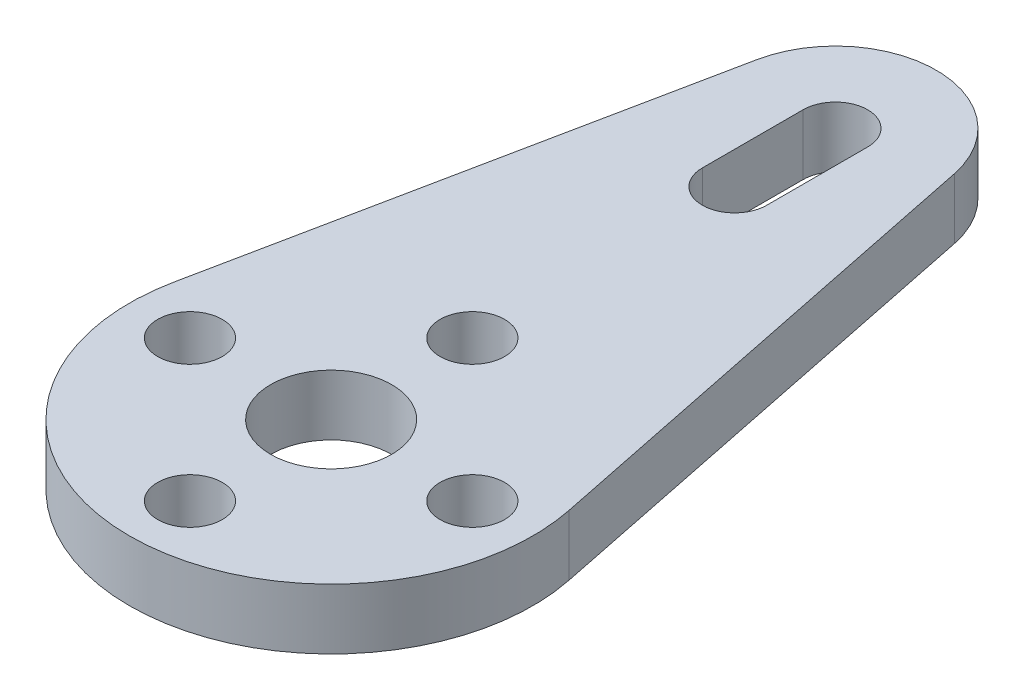
ISO-10303-21;
HEADER;
FILE_DESCRIPTION(('STEP AP214'),'2;1');
FILE_NAME('part.step','',(''),(''),'','','');
FILE_SCHEMA(('AUTOMOTIVE_DESIGN { 1 0 10303 214 1 1 1 1 }'));
ENDSEC;
DATA;
#1=APPLICATION_CONTEXT('core data for automotive mechanical design processes');
#2=APPLICATION_PROTOCOL_DEFINITION('international standard','automotive_design',2000,#1);
#3=PRODUCT_CONTEXT('',#1,'mechanical');
#4=PRODUCT('Part','Part','',(#3));
#5=PRODUCT_RELATED_PRODUCT_CATEGORY('part','',(#4));
#6=PRODUCT_DEFINITION_FORMATION('','',#4);
#7=PRODUCT_DEFINITION_CONTEXT('part definition',#1,'design');
#8=PRODUCT_DEFINITION('design','',#6,#7);
#9=PRODUCT_DEFINITION_SHAPE('','',#8);
#10=(LENGTH_UNIT() NAMED_UNIT(*) SI_UNIT(.MILLI.,.METRE.));
#11=(NAMED_UNIT(*) PLANE_ANGLE_UNIT() SI_UNIT($,.RADIAN.));
#12=(NAMED_UNIT(*) SI_UNIT($,.STERADIAN.) SOLID_ANGLE_UNIT());
#13=UNCERTAINTY_MEASURE_WITH_UNIT(LENGTH_MEASURE(1.E-05),#10,'distance_accuracy_value','');
#14=(GEOMETRIC_REPRESENTATION_CONTEXT(3) GLOBAL_UNCERTAINTY_ASSIGNED_CONTEXT((#13)) GLOBAL_UNIT_ASSIGNED_CONTEXT((#10,
#11,#12)) REPRESENTATION_CONTEXT('',''));
#15=CARTESIAN_POINT('',(0.,0.,0.));
#16=DIRECTION('',(0.,0.,1.));
#17=DIRECTION('',(1.,0.,0.));
#18=AXIS2_PLACEMENT_3D('',#15,#16,#17);
#19=CARTESIAN_POINT('',(0.,3.,-25.));
#20=DIRECTION('',(0.,1.,0.));
#21=DIRECTION('',(0.,0.,1.));
#22=AXIS2_PLACEMENT_3D('',#19,#20,#21);
#23=PLANE('',#22);
#24=CARTESIAN_POINT('',(3.9618942650685E-13,3.,7.));
#25=DIRECTION('',(0.,1.,0.));
#26=DIRECTION('',(0.,0.,1.));
#27=AXIS2_PLACEMENT_3D('',#24,#25,#26);
#28=CIRCLE('',#27,1.60000000000043);
#29=CARTESIAN_POINT('',(3.9618942650685E-13,3.,8.60000000000043));
#30=VERTEX_POINT('',#29);
#31=EDGE_CURVE('E139',#30,#30,#28,.T.);
#32=ORIENTED_EDGE('',*,*,#31,.F.);
#33=EDGE_LOOP('',(#32));
#34=FACE_BOUND('',#33,.T.);
#35=CARTESIAN_POINT('',(0.,3.,-7.));
#36=DIRECTION('',(0.,1.,0.));
#37=DIRECTION('',(0.,0.,1.));
#38=AXIS2_PLACEMENT_3D('',#35,#36,#37);
#39=CIRCLE('',#38,1.6);
#40=CARTESIAN_POINT('',(0.,3.,-5.4));
#41=VERTEX_POINT('',#40);
#42=EDGE_CURVE('E151',#41,#41,#39,.T.);
#43=ORIENTED_EDGE('',*,*,#42,.F.);
#44=EDGE_LOOP('',(#43));
#45=FACE_BOUND('',#44,.T.);
#46=CARTESIAN_POINT('',(0.,3.,-25.));
#47=DIRECTION('',(0.,1.,0.));
#48=DIRECTION('',(0.,0.,1.));
#49=AXIS2_PLACEMENT_3D('',#46,#47,#48);
#50=CIRCLE('',#49,5.);
#51=CARTESIAN_POINT('',(4.89897948556635,3.,-26.));
#52=VERTEX_POINT('',#51);
#53=CARTESIAN_POINT('',(-4.89897948556636,3.,-26.));
#54=VERTEX_POINT('',#53);
#55=EDGE_CURVE('E163',#52,#54,#50,.T.);
#56=ORIENTED_EDGE('',*,*,#55,.T.);
#57=DIRECTION('',(-0.2,0.,0.979795897113271));
#58=VECTOR('',#57,1.);
#59=CARTESIAN_POINT('',(-4.89897948556636,3.,-26.));
#60=LINE('',#59,#58);
#61=CARTESIAN_POINT('',(-9.79795897113271,3.,-2.));
#62=VERTEX_POINT('',#61);
#63=EDGE_CURVE('E166',#54,#62,#60,.T.);
#64=ORIENTED_EDGE('',*,*,#63,.T.);
#65=CARTESIAN_POINT('',(0.,3.,0.));
#66=DIRECTION('',(0.,1.,0.));
#67=DIRECTION('',(0.,0.,1.));
#68=AXIS2_PLACEMENT_3D('',#65,#66,#67);
#69=CIRCLE('',#68,10.);
#70=CARTESIAN_POINT('',(9.79795897113271,3.,-2.));
#71=VERTEX_POINT('',#70);
#72=EDGE_CURVE('E169',#62,#71,#69,.T.);
#73=ORIENTED_EDGE('',*,*,#72,.T.);
#74=DIRECTION('',(-0.2,0.,-0.979795897113271));
#75=VECTOR('',#74,1.);
#76=CARTESIAN_POINT('',(4.89897948556635,3.,-26.));
#77=LINE('',#76,#75);
#78=EDGE_CURVE('E171',#71,#52,#77,.T.);
#79=ORIENTED_EDGE('',*,*,#78,.T.);
#80=EDGE_LOOP('',(#56,#64,#73,#79));
#81=FACE_BOUND('',#80,.T.);
#82=CARTESIAN_POINT('',(0.,3.,0.));
#83=DIRECTION('',(0.,1.,0.));
#84=DIRECTION('',(0.,0.,1.));
#85=AXIS2_PLACEMENT_3D('',#82,#83,#84);
#86=CIRCLE('',#85,3.);
#87=CARTESIAN_POINT('',(0.,3.,3.));
#88=VERTEX_POINT('',#87);
#89=EDGE_CURVE('E157',#88,#88,#86,.T.);
#90=ORIENTED_EDGE('',*,*,#89,.F.);
#91=EDGE_LOOP('',(#90));
#92=FACE_BOUND('',#91,.T.);
#93=CARTESIAN_POINT('',(7.0000000000002,3.,-1.98094713253425E-13));
#94=DIRECTION('',(0.,1.,0.));
#95=DIRECTION('',(0.,0.,1.));
#96=AXIS2_PLACEMENT_3D('',#93,#94,#95);
#97=CIRCLE('',#96,1.60000000000016);
#98=CARTESIAN_POINT('',(7.0000000000002,3.,1.59999999999996));
#99=VERTEX_POINT('',#98);
#100=EDGE_CURVE('E145',#99,#99,#97,.T.);
#101=ORIENTED_EDGE('',*,*,#100,.F.);
#102=EDGE_LOOP('',(#101));
#103=FACE_BOUND('',#102,.T.);
#104=CARTESIAN_POINT('',(-6.9999999999998,3.,1.98951966012828E-13));
#105=DIRECTION('',(0.,1.,0.));
#106=DIRECTION('',(0.,0.,1.));
#107=AXIS2_PLACEMENT_3D('',#104,#105,#106);
#108=CIRCLE('',#107,1.60000000000032);
#109=CARTESIAN_POINT('',(-6.9999999999998,3.,1.60000000000052));
#110=VERTEX_POINT('',#109);
#111=EDGE_CURVE('E133',#110,#110,#108,.T.);
#112=ORIENTED_EDGE('',*,*,#111,.F.);
#113=EDGE_LOOP('',(#112));
#114=FACE_BOUND('',#113,.T.);
#115=DIRECTION('',(0.,0.,1.));
#116=VECTOR('',#115,1.);
#117=CARTESIAN_POINT('',(-1.6,3.,-25.));
#118=LINE('',#117,#116);
#119=CARTESIAN_POINT('',(-1.6,3.,-25.));
#120=VERTEX_POINT('',#119);
#121=CARTESIAN_POINT('',(-1.6,3.,-20.));
#122=VERTEX_POINT('',#121);
#123=EDGE_CURVE('E105',#120,#122,#118,.T.);
#124=ORIENTED_EDGE('',*,*,#123,.F.);
#125=CARTESIAN_POINT('',(0.,3.,-25.));
#126=DIRECTION('',(0.,1.,0.));
#127=DIRECTION('',(0.,0.,1.));
#128=AXIS2_PLACEMENT_3D('',#125,#126,#127);
#129=CIRCLE('',#128,1.6);
#130=CARTESIAN_POINT('',(1.6,3.,-25.));
#131=VERTEX_POINT('',#130);
#132=EDGE_CURVE('E97',#131,#120,#129,.T.);
#133=ORIENTED_EDGE('',*,*,#132,.F.);
#134=DIRECTION('',(0.,0.,-1.));
#135=VECTOR('',#134,1.);
#136=CARTESIAN_POINT('',(1.6,3.,-25.));
#137=LINE('',#136,#135);
#138=CARTESIAN_POINT('',(1.6,3.,-20.));
#139=VERTEX_POINT('',#138);
#140=EDGE_CURVE('E119',#139,#131,#137,.T.);
#141=ORIENTED_EDGE('',*,*,#140,.F.);
#142=CARTESIAN_POINT('',(0.,3.,-20.));
#143=DIRECTION('',(0.,1.,0.));
#144=DIRECTION('',(0.,0.,1.));
#145=AXIS2_PLACEMENT_3D('',#142,#143,#144);
#146=CIRCLE('',#145,1.6);
#147=EDGE_CURVE('E117',#122,#139,#146,.T.);
#148=ORIENTED_EDGE('',*,*,#147,.F.);
#149=EDGE_LOOP('',(#124,#133,#141,#148));
#150=FACE_BOUND('',#149,.T.);
#151=ADVANCED_FACE('F32',(#34,#45,#81,#92,#103,#114,#150),#23,.T.);
#152=CARTESIAN_POINT('',(0.,0.,-25.));
#153=DIRECTION('',(0.,1.,0.));
#154=DIRECTION('',(0.,0.,1.));
#155=AXIS2_PLACEMENT_3D('',#152,#153,#154);
#156=PLANE('',#155);
#157=CARTESIAN_POINT('',(-6.9999999999998,0.,1.98951966012828E-13));
#158=DIRECTION('',(0.,1.,0.));
#159=DIRECTION('',(0.,0.,1.));
#160=AXIS2_PLACEMENT_3D('',#157,#158,#159);
#161=CIRCLE('',#160,1.60000000000032);
#162=CARTESIAN_POINT('',(-6.9999999999998,0.,1.60000000000052));
#163=VERTEX_POINT('',#162);
#164=EDGE_CURVE('E113',#163,#163,#161,.T.);
#165=ORIENTED_EDGE('',*,*,#164,.T.);
#166=EDGE_LOOP('',(#165));
#167=FACE_BOUND('',#166,.T.);
#168=CARTESIAN_POINT('',(3.9618942650685E-13,0.,7.));
#169=DIRECTION('',(0.,1.,0.));
#170=DIRECTION('',(0.,0.,1.));
#171=AXIS2_PLACEMENT_3D('',#168,#169,#170);
#172=CIRCLE('',#171,1.60000000000043);
#173=CARTESIAN_POINT('',(3.9618942650685E-13,0.,8.60000000000043));
#174=VERTEX_POINT('',#173);
#175=EDGE_CURVE('E136',#174,#174,#172,.T.);
#176=ORIENTED_EDGE('',*,*,#175,.T.);
#177=EDGE_LOOP('',(#176));
#178=FACE_BOUND('',#177,.T.);
#179=CARTESIAN_POINT('',(7.0000000000002,0.,-1.98094713253425E-13));
#180=DIRECTION('',(0.,1.,0.));
#181=DIRECTION('',(0.,0.,1.));
#182=AXIS2_PLACEMENT_3D('',#179,#180,#181);
#183=CIRCLE('',#182,1.60000000000016);
#184=CARTESIAN_POINT('',(7.0000000000002,0.,1.59999999999996));
#185=VERTEX_POINT('',#184);
#186=EDGE_CURVE('E142',#185,#185,#183,.T.);
#187=ORIENTED_EDGE('',*,*,#186,.T.);
#188=EDGE_LOOP('',(#187));
#189=FACE_BOUND('',#188,.T.);
#190=CARTESIAN_POINT('',(0.,0.,-7.));
#191=DIRECTION('',(0.,1.,0.));
#192=DIRECTION('',(0.,0.,1.));
#193=AXIS2_PLACEMENT_3D('',#190,#191,#192);
#194=CIRCLE('',#193,1.6);
#195=CARTESIAN_POINT('',(0.,0.,-5.4));
#196=VERTEX_POINT('',#195);
#197=EDGE_CURVE('E148',#196,#196,#194,.T.);
#198=ORIENTED_EDGE('',*,*,#197,.T.);
#199=EDGE_LOOP('',(#198));
#200=FACE_BOUND('',#199,.T.);
#201=CARTESIAN_POINT('',(0.,0.,0.));
#202=DIRECTION('',(0.,1.,0.));
#203=DIRECTION('',(0.,0.,1.));
#204=AXIS2_PLACEMENT_3D('',#201,#202,#203);
#205=CIRCLE('',#204,3.);
#206=CARTESIAN_POINT('',(0.,0.,3.));
#207=VERTEX_POINT('',#206);
#208=EDGE_CURVE('E154',#207,#207,#205,.T.);
#209=ORIENTED_EDGE('',*,*,#208,.T.);
#210=EDGE_LOOP('',(#209));
#211=FACE_BOUND('',#210,.T.);
#212=CARTESIAN_POINT('',(0.,0.,-25.));
#213=DIRECTION('',(0.,1.,0.));
#214=DIRECTION('',(0.,0.,1.));
#215=AXIS2_PLACEMENT_3D('',#212,#213,#214);
#216=CIRCLE('',#215,5.);
#217=CARTESIAN_POINT('',(4.89897948556635,0.,-26.));
#218=VERTEX_POINT('',#217);
#219=CARTESIAN_POINT('',(-4.89897948556636,0.,-26.));
#220=VERTEX_POINT('',#219);
#221=EDGE_CURVE('E160',#218,#220,#216,.T.);
#222=ORIENTED_EDGE('',*,*,#221,.F.);
#223=DIRECTION('',(-0.2,0.,-0.979795897113271));
#224=VECTOR('',#223,1.);
#225=CARTESIAN_POINT('',(4.89897948556635,0.,-26.));
#226=LINE('',#225,#224);
#227=CARTESIAN_POINT('',(9.79795897113271,0.,-2.));
#228=VERTEX_POINT('',#227);
#229=EDGE_CURVE('E167',#228,#218,#226,.T.);
#230=ORIENTED_EDGE('',*,*,#229,.F.);
#231=CARTESIAN_POINT('',(0.,0.,0.));
#232=DIRECTION('',(0.,1.,0.));
#233=DIRECTION('',(0.,0.,1.));
#234=AXIS2_PLACEMENT_3D('',#231,#232,#233);
#235=CIRCLE('',#234,10.);
#236=CARTESIAN_POINT('',(-9.79795897113271,0.,-2.));
#237=VERTEX_POINT('',#236);
#238=EDGE_CURVE('E178',#237,#228,#235,.T.);
#239=ORIENTED_EDGE('',*,*,#238,.F.);
#240=DIRECTION('',(-0.2,0.,0.979795897113271));
#241=VECTOR('',#240,1.);
#242=CARTESIAN_POINT('',(-4.89897948556636,0.,-26.));
#243=LINE('',#242,#241);
#244=EDGE_CURVE('E176',#220,#237,#243,.T.);
#245=ORIENTED_EDGE('',*,*,#244,.F.);
#246=EDGE_LOOP('',(#222,#230,#239,#245));
#247=FACE_BOUND('',#246,.T.);
#248=CARTESIAN_POINT('',(0.,0.,-25.));
#249=DIRECTION('',(0.,1.,0.));
#250=DIRECTION('',(0.,0.,1.));
#251=AXIS2_PLACEMENT_3D('',#248,#249,#250);
#252=CIRCLE('',#251,1.6);
#253=CARTESIAN_POINT('',(1.6,0.,-25.));
#254=VERTEX_POINT('',#253);
#255=CARTESIAN_POINT('',(-1.6,0.,-25.));
#256=VERTEX_POINT('',#255);
#257=EDGE_CURVE('E55',#254,#256,#252,.T.);
#258=ORIENTED_EDGE('',*,*,#257,.T.);
#259=DIRECTION('',(0.,0.,1.));
#260=VECTOR('',#259,1.);
#261=CARTESIAN_POINT('',(-1.6,0.,-25.));
#262=LINE('',#261,#260);
#263=CARTESIAN_POINT('',(-1.6,0.,-20.));
#264=VERTEX_POINT('',#263);
#265=EDGE_CURVE('E112',#256,#264,#262,.T.);
#266=ORIENTED_EDGE('',*,*,#265,.T.);
#267=CARTESIAN_POINT('',(0.,0.,-20.));
#268=DIRECTION('',(0.,1.,0.));
#269=DIRECTION('',(0.,0.,1.));
#270=AXIS2_PLACEMENT_3D('',#267,#268,#269);
#271=CIRCLE('',#270,1.6);
#272=CARTESIAN_POINT('',(1.6,0.,-20.));
#273=VERTEX_POINT('',#272);
#274=EDGE_CURVE('E125',#264,#273,#271,.T.);
#275=ORIENTED_EDGE('',*,*,#274,.T.);
#276=DIRECTION('',(0.,0.,-1.));
#277=VECTOR('',#276,1.);
#278=CARTESIAN_POINT('',(1.6,0.,-25.));
#279=LINE('',#278,#277);
#280=EDGE_CURVE('E106',#273,#254,#279,.T.);
#281=ORIENTED_EDGE('',*,*,#280,.T.);
#282=EDGE_LOOP('',(#258,#266,#275,#281));
#283=FACE_BOUND('',#282,.T.);
#284=ADVANCED_FACE('F196',(#167,#178,#189,#200,#211,#247,#283),#156,.F.);
#285=CARTESIAN_POINT('',(0.,3.,-25.));
#286=DIRECTION('',(0.,-1.,0.));
#287=DIRECTION('',(0.,0.,-1.));
#288=AXIS2_PLACEMENT_3D('',#285,#286,#287);
#289=CYLINDRICAL_SURFACE('',#288,5.);
#290=ORIENTED_EDGE('',*,*,#221,.T.);
#291=DIRECTION('',(0.,-1.,0.));
#292=VECTOR('',#291,1.);
#293=CARTESIAN_POINT('',(-4.89897948556636,3.,-26.));
#294=LINE('',#293,#292);
#295=EDGE_CURVE('E11',#54,#220,#294,.T.);
#296=ORIENTED_EDGE('',*,*,#295,.F.);
#297=ORIENTED_EDGE('',*,*,#55,.F.);
#298=DIRECTION('',(0.,-1.,0.));
#299=VECTOR('',#298,1.);
#300=CARTESIAN_POINT('',(4.89897948556635,3.,-26.));
#301=LINE('',#300,#299);
#302=EDGE_CURVE('E173',#52,#218,#301,.T.);
#303=ORIENTED_EDGE('',*,*,#302,.T.);
#304=EDGE_LOOP('',(#290,#296,#297,#303));
#305=FACE_BOUND('',#304,.T.);
#306=ADVANCED_FACE('F34',(#305),#289,.T.);
#307=CARTESIAN_POINT('',(-4.89897948556636,3.,-26.));
#308=DIRECTION('',(0.979795897113271,0.,0.2));
#309=DIRECTION('',(0.2,0.,-0.979795897113271));
#310=AXIS2_PLACEMENT_3D('',#307,#308,#309);
#311=PLANE('',#310);
#312=ORIENTED_EDGE('',*,*,#244,.T.);
#313=DIRECTION('',(0.,-1.,0.));
#314=VECTOR('',#313,1.);
#315=CARTESIAN_POINT('',(-9.79795897113271,3.,-2.));
#316=LINE('',#315,#314);
#317=EDGE_CURVE('E40',#62,#237,#316,.T.);
#318=ORIENTED_EDGE('',*,*,#317,.F.);
#319=ORIENTED_EDGE('',*,*,#63,.F.);
#320=ORIENTED_EDGE('',*,*,#295,.T.);
#321=EDGE_LOOP('',(#312,#318,#319,#320));
#322=FACE_BOUND('',#321,.T.);
#323=ADVANCED_FACE('F207',(#322),#311,.F.);
#324=CARTESIAN_POINT('',(0.,3.,0.));
#325=DIRECTION('',(0.,-1.,0.));
#326=DIRECTION('',(0.,0.,-1.));
#327=AXIS2_PLACEMENT_3D('',#324,#325,#326);
#328=CYLINDRICAL_SURFACE('',#327,10.);
#329=ORIENTED_EDGE('',*,*,#238,.T.);
#330=DIRECTION('',(0.,-1.,0.));
#331=VECTOR('',#330,1.);
#332=CARTESIAN_POINT('',(9.79795897113271,3.,-2.));
#333=LINE('',#332,#331);
#334=EDGE_CURVE('E183',#71,#228,#333,.T.);
#335=ORIENTED_EDGE('',*,*,#334,.F.);
#336=ORIENTED_EDGE('',*,*,#72,.F.);
#337=ORIENTED_EDGE('',*,*,#317,.T.);
#338=EDGE_LOOP('',(#329,#335,#336,#337));
#339=FACE_BOUND('',#338,.T.);
#340=ADVANCED_FACE('F190',(#339),#328,.T.);
#341=CARTESIAN_POINT('',(4.89897948556635,3.,-26.));
#342=DIRECTION('',(-0.979795897113271,0.,0.2));
#343=DIRECTION('',(0.2,0.,0.979795897113271));
#344=AXIS2_PLACEMENT_3D('',#341,#342,#343);
#345=PLANE('',#344);
#346=ORIENTED_EDGE('',*,*,#229,.T.);
#347=ORIENTED_EDGE('',*,*,#302,.F.);
#348=ORIENTED_EDGE('',*,*,#78,.F.);
#349=ORIENTED_EDGE('',*,*,#334,.T.);
#350=EDGE_LOOP('',(#346,#347,#348,#349));
#351=FACE_BOUND('',#350,.T.);
#352=ADVANCED_FACE('F200',(#351),#345,.F.);
#353=CARTESIAN_POINT('',(0.,3.,0.));
#354=DIRECTION('',(0.,-1.,0.));
#355=DIRECTION('',(0.,0.,-1.));
#356=AXIS2_PLACEMENT_3D('',#353,#354,#355);
#357=CYLINDRICAL_SURFACE('',#356,3.);
#358=ORIENTED_EDGE('',*,*,#89,.T.);
#359=EDGE_LOOP('',(#358));
#360=FACE_BOUND('',#359,.T.);
#361=ORIENTED_EDGE('',*,*,#208,.F.);
#362=EDGE_LOOP('',(#361));
#363=FACE_BOUND('',#362,.T.);
#364=ADVANCED_FACE('F225',(#360,#363),#357,.F.);
#365=CARTESIAN_POINT('',(0.,3.,-7.));
#366=DIRECTION('',(0.,-1.,0.));
#367=DIRECTION('',(0.,0.,-1.));
#368=AXIS2_PLACEMENT_3D('',#365,#366,#367);
#369=CYLINDRICAL_SURFACE('',#368,1.6);
#370=ORIENTED_EDGE('',*,*,#42,.T.);
#371=EDGE_LOOP('',(#370));
#372=FACE_BOUND('',#371,.T.);
#373=ORIENTED_EDGE('',*,*,#197,.F.);
#374=EDGE_LOOP('',(#373));
#375=FACE_BOUND('',#374,.T.);
#376=ADVANCED_FACE('F232',(#372,#375),#369,.F.);
#377=CARTESIAN_POINT('',(7.0000000000002,3.,-1.98094713253425E-13));
#378=DIRECTION('',(0.,-1.,0.));
#379=DIRECTION('',(0.,0.,-1.));
#380=AXIS2_PLACEMENT_3D('',#377,#378,#379);
#381=CYLINDRICAL_SURFACE('',#380,1.60000000000016);
#382=ORIENTED_EDGE('',*,*,#100,.T.);
#383=EDGE_LOOP('',(#382));
#384=FACE_BOUND('',#383,.T.);
#385=ORIENTED_EDGE('',*,*,#186,.F.);
#386=EDGE_LOOP('',(#385));
#387=FACE_BOUND('',#386,.T.);
#388=ADVANCED_FACE('F237',(#384,#387),#381,.F.);
#389=CARTESIAN_POINT('',(3.9618942650685E-13,3.,7.));
#390=DIRECTION('',(0.,-1.,0.));
#391=DIRECTION('',(0.,0.,-1.));
#392=AXIS2_PLACEMENT_3D('',#389,#390,#391);
#393=CYLINDRICAL_SURFACE('',#392,1.60000000000043);
#394=ORIENTED_EDGE('',*,*,#31,.T.);
#395=EDGE_LOOP('',(#394));
#396=FACE_BOUND('',#395,.T.);
#397=ORIENTED_EDGE('',*,*,#175,.F.);
#398=EDGE_LOOP('',(#397));
#399=FACE_BOUND('',#398,.T.);
#400=ADVANCED_FACE('F251',(#396,#399),#393,.F.);
#401=CARTESIAN_POINT('',(-6.9999999999998,3.,1.98951966012828E-13));
#402=DIRECTION('',(0.,-1.,0.));
#403=DIRECTION('',(0.,0.,-1.));
#404=AXIS2_PLACEMENT_3D('',#401,#402,#403);
#405=CYLINDRICAL_SURFACE('',#404,1.60000000000032);
#406=ORIENTED_EDGE('',*,*,#111,.T.);
#407=EDGE_LOOP('',(#406));
#408=FACE_BOUND('',#407,.T.);
#409=ORIENTED_EDGE('',*,*,#164,.F.);
#410=EDGE_LOOP('',(#409));
#411=FACE_BOUND('',#410,.T.);
#412=ADVANCED_FACE('F248',(#408,#411),#405,.F.);
#413=CARTESIAN_POINT('',(0.,3.,-25.));
#414=DIRECTION('',(0.,-1.,0.));
#415=DIRECTION('',(0.,0.,-1.));
#416=AXIS2_PLACEMENT_3D('',#413,#414,#415);
#417=CYLINDRICAL_SURFACE('',#416,1.6);
#418=ORIENTED_EDGE('',*,*,#257,.F.);
#419=DIRECTION('',(0.,-1.,0.));
#420=VECTOR('',#419,1.);
#421=CARTESIAN_POINT('',(1.6,3.,-25.));
#422=LINE('',#421,#420);
#423=EDGE_CURVE('E101',#131,#254,#422,.T.);
#424=ORIENTED_EDGE('',*,*,#423,.F.);
#425=ORIENTED_EDGE('',*,*,#132,.T.);
#426=DIRECTION('',(0.,-1.,0.));
#427=VECTOR('',#426,1.);
#428=CARTESIAN_POINT('',(-1.6,3.,-25.));
#429=LINE('',#428,#427);
#430=EDGE_CURVE('E100',#120,#256,#429,.T.);
#431=ORIENTED_EDGE('',*,*,#430,.T.);
#432=EDGE_LOOP('',(#418,#424,#425,#431));
#433=FACE_BOUND('',#432,.T.);
#434=ADVANCED_FACE('F99',(#433),#417,.F.);
#435=CARTESIAN_POINT('',(-1.6,3.,-25.));
#436=DIRECTION('',(1.,0.,0.));
#437=DIRECTION('',(0.,0.,-1.));
#438=AXIS2_PLACEMENT_3D('',#435,#436,#437);
#439=PLANE('',#438);
#440=ORIENTED_EDGE('',*,*,#265,.F.);
#441=ORIENTED_EDGE('',*,*,#430,.F.);
#442=ORIENTED_EDGE('',*,*,#123,.T.);
#443=DIRECTION('',(0.,-1.,0.));
#444=VECTOR('',#443,1.);
#445=CARTESIAN_POINT('',(-1.6,3.,-20.));
#446=LINE('',#445,#444);
#447=EDGE_CURVE('E114',#122,#264,#446,.T.);
#448=ORIENTED_EDGE('',*,*,#447,.T.);
#449=EDGE_LOOP('',(#440,#441,#442,#448));
#450=FACE_BOUND('',#449,.T.);
#451=ADVANCED_FACE('F109',(#450),#439,.T.);
#452=CARTESIAN_POINT('',(0.,3.,-20.));
#453=DIRECTION('',(0.,-1.,0.));
#454=DIRECTION('',(0.,0.,-1.));
#455=AXIS2_PLACEMENT_3D('',#452,#453,#454);
#456=CYLINDRICAL_SURFACE('',#455,1.6);
#457=ORIENTED_EDGE('',*,*,#274,.F.);
#458=ORIENTED_EDGE('',*,*,#447,.F.);
#459=ORIENTED_EDGE('',*,*,#147,.T.);
#460=DIRECTION('',(0.,-1.,0.));
#461=VECTOR('',#460,1.);
#462=CARTESIAN_POINT('',(1.6,3.,-20.));
#463=LINE('',#462,#461);
#464=EDGE_CURVE('E47',#139,#273,#463,.T.);
#465=ORIENTED_EDGE('',*,*,#464,.T.);
#466=EDGE_LOOP('',(#457,#458,#459,#465));
#467=FACE_BOUND('',#466,.T.);
#468=ADVANCED_FACE('F275',(#467),#456,.F.);
#469=CARTESIAN_POINT('',(1.6,3.,-25.));
#470=DIRECTION('',(-1.,0.,0.));
#471=DIRECTION('',(0.,0.,1.));
#472=AXIS2_PLACEMENT_3D('',#469,#470,#471);
#473=PLANE('',#472);
#474=ORIENTED_EDGE('',*,*,#280,.F.);
#475=ORIENTED_EDGE('',*,*,#464,.F.);
#476=ORIENTED_EDGE('',*,*,#140,.T.);
#477=ORIENTED_EDGE('',*,*,#423,.T.);
#478=EDGE_LOOP('',(#474,#475,#476,#477));
#479=FACE_BOUND('',#478,.T.);
#480=ADVANCED_FACE('F278',(#479),#473,.T.);
#481=CLOSED_SHELL('',(#151,#284,#306,#323,#340,#352,#364,#376,#388,#400,#412,#434,#451,#468,#480));
#482=MANIFOLD_SOLID_BREP('B2',#481);
#483=ADVANCED_BREP_SHAPE_REPRESENTATION('',(#18,#482),#14);
#484=SHAPE_DEFINITION_REPRESENTATION(#9,#483);
ENDSEC;
END-ISO-10303-21;
